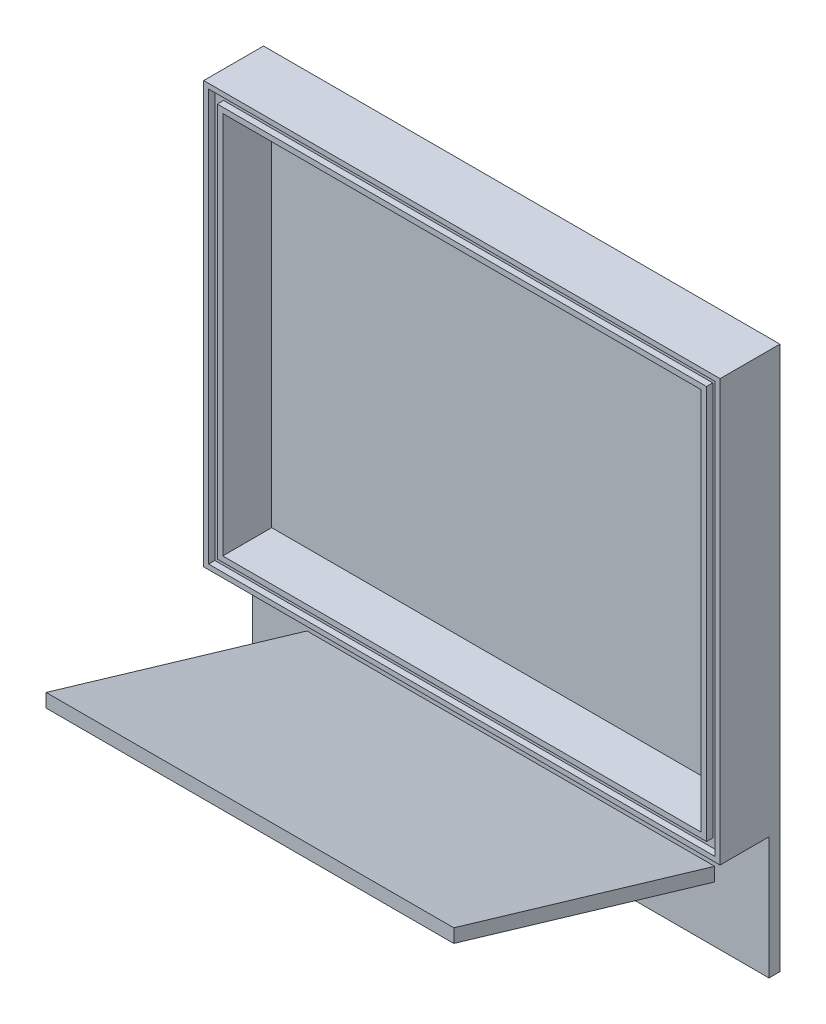
ISO-10303-21;
HEADER;
FILE_DESCRIPTION(('STEP AP214'),'2;1');
FILE_NAME('part.step','',(''),(''),'','','');
FILE_SCHEMA(('AUTOMOTIVE_DESIGN { 1 0 10303 214 1 1 1 1 }'));
ENDSEC;
DATA;
#1=APPLICATION_CONTEXT('core data for automotive mechanical design processes');
#2=APPLICATION_PROTOCOL_DEFINITION('international standard','automotive_design',2000,#1);
#3=PRODUCT_CONTEXT('',#1,'mechanical');
#4=PRODUCT('Part','Part','',(#3));
#5=PRODUCT_RELATED_PRODUCT_CATEGORY('part','',(#4));
#6=PRODUCT_DEFINITION_FORMATION('','',#4);
#7=PRODUCT_DEFINITION_CONTEXT('part definition',#1,'design');
#8=PRODUCT_DEFINITION('design','',#6,#7);
#9=PRODUCT_DEFINITION_SHAPE('','',#8);
#10=(LENGTH_UNIT() NAMED_UNIT(*) SI_UNIT(.MILLI.,.METRE.));
#11=(NAMED_UNIT(*) PLANE_ANGLE_UNIT() SI_UNIT($,.RADIAN.));
#12=(NAMED_UNIT(*) SI_UNIT($,.STERADIAN.) SOLID_ANGLE_UNIT());
#13=UNCERTAINTY_MEASURE_WITH_UNIT(LENGTH_MEASURE(1.E-05),#10,'distance_accuracy_value','');
#14=(GEOMETRIC_REPRESENTATION_CONTEXT(3) GLOBAL_UNCERTAINTY_ASSIGNED_CONTEXT((#13)) GLOBAL_UNIT_ASSIGNED_CONTEXT((#10,
#11,#12)) REPRESENTATION_CONTEXT('',''));
#15=CARTESIAN_POINT('',(0.,0.,0.));
#16=DIRECTION('',(0.,0.,1.));
#17=DIRECTION('',(1.,0.,0.));
#18=AXIS2_PLACEMENT_3D('',#15,#16,#17);
#19=CARTESIAN_POINT('',(0.,0.,4.));
#20=DIRECTION('',(0.,0.,-1.));
#21=DIRECTION('',(-1.,0.,0.));
#22=AXIS2_PLACEMENT_3D('',#19,#20,#21);
#23=PLANE('',#22);
#24=DIRECTION('',(1.,0.,0.));
#25=VECTOR('',#24,1.);
#26=CARTESIAN_POINT('',(0.,45.,4.));
#27=LINE('',#26,#25);
#28=CARTESIAN_POINT('',(-95.,45.,4.));
#29=VERTEX_POINT('',#28);
#30=CARTESIAN_POINT('',(95.,45.,4.));
#31=VERTEX_POINT('',#30);
#32=EDGE_CURVE('E353',#29,#31,#27,.T.);
#33=ORIENTED_EDGE('',*,*,#32,.F.);
#34=DIRECTION('',(0.,-1.,0.));
#35=VECTOR('',#34,1.);
#36=CARTESIAN_POINT('',(-95.,0.,4.));
#37=LINE('',#36,#35);
#38=CARTESIAN_POINT('',(-95.,0.,4.));
#39=VERTEX_POINT('',#38);
#40=EDGE_CURVE('E329',#29,#39,#37,.T.);
#41=ORIENTED_EDGE('',*,*,#40,.T.);
#42=DIRECTION('',(1.,0.,0.));
#43=VECTOR('',#42,1.);
#44=CARTESIAN_POINT('',(-95.,0.,4.));
#45=LINE('',#44,#43);
#46=CARTESIAN_POINT('',(95.,0.,4.));
#47=VERTEX_POINT('',#46);
#48=EDGE_CURVE('E335',#39,#47,#45,.T.);
#49=ORIENTED_EDGE('',*,*,#48,.T.);
#50=DIRECTION('',(0.,1.,0.));
#51=VECTOR('',#50,1.);
#52=CARTESIAN_POINT('',(95.,0.,4.));
#53=LINE('',#52,#51);
#54=EDGE_CURVE('E333',#47,#31,#53,.T.);
#55=ORIENTED_EDGE('',*,*,#54,.T.);
#56=EDGE_LOOP('',(#33,#41,#49,#55));
#57=FACE_BOUND('',#56,.T.);
#58=DIRECTION('',(0.,-1.,0.));
#59=VECTOR('',#58,1.);
#60=CARTESIAN_POINT('',(-75.,0.,4.));
#61=LINE('',#60,#59);
#62=CARTESIAN_POINT('',(-75.,25.5918367346939,4.));
#63=VERTEX_POINT('',#62);
#64=CARTESIAN_POINT('',(-75.,20.5918367346939,4.));
#65=VERTEX_POINT('',#64);
#66=EDGE_CURVE('E11',#63,#65,#61,.T.);
#67=ORIENTED_EDGE('',*,*,#66,.F.);
#68=DIRECTION('',(1.,0.,0.));
#69=VECTOR('',#68,1.);
#70=CARTESIAN_POINT('',(0.,25.5918367346939,4.));
#71=LINE('',#70,#69);
#72=CARTESIAN_POINT('',(75.,25.5918367346939,4.));
#73=VERTEX_POINT('',#72);
#74=EDGE_CURVE('E360',#63,#73,#71,.T.);
#75=ORIENTED_EDGE('',*,*,#74,.T.);
#76=DIRECTION('',(0.,-1.,0.));
#77=VECTOR('',#76,1.);
#78=CARTESIAN_POINT('',(75.,0.,4.));
#79=LINE('',#78,#77);
#80=CARTESIAN_POINT('',(75.,20.5918367346939,4.));
#81=VERTEX_POINT('',#80);
#82=EDGE_CURVE('E194',#73,#81,#79,.T.);
#83=ORIENTED_EDGE('',*,*,#82,.T.);
#84=DIRECTION('',(-1.,0.,0.));
#85=VECTOR('',#84,1.);
#86=CARTESIAN_POINT('',(0.,20.5918367346939,4.));
#87=LINE('',#86,#85);
#88=EDGE_CURVE('E50',#81,#65,#87,.T.);
#89=ORIENTED_EDGE('',*,*,#88,.T.);
#90=EDGE_LOOP('',(#67,#75,#83,#89));
#91=FACE_BOUND('',#90,.T.);
#92=ADVANCED_FACE('F39',(#57,#91),#23,.F.);
#93=CARTESIAN_POINT('',(-95.,0.,4.));
#94=DIRECTION('',(1.,0.,0.));
#95=DIRECTION('',(0.,0.,-1.));
#96=AXIS2_PLACEMENT_3D('',#93,#94,#95);
#97=PLANE('',#96);
#98=ORIENTED_EDGE('',*,*,#40,.F.);
#99=DIRECTION('',(0.,0.,-1.));
#100=VECTOR('',#99,1.);
#101=CARTESIAN_POINT('',(-95.,45.,22.));
#102=LINE('',#101,#100);
#103=CARTESIAN_POINT('',(-95.,45.,22.));
#104=VERTEX_POINT('',#103);
#105=EDGE_CURVE('E314',#104,#29,#102,.T.);
#106=ORIENTED_EDGE('',*,*,#105,.F.);
#107=DIRECTION('',(0.,-1.,0.));
#108=VECTOR('',#107,1.);
#109=CARTESIAN_POINT('',(-95.,45.,22.));
#110=LINE('',#109,#108);
#111=CARTESIAN_POINT('',(-95.,200.,22.));
#112=VERTEX_POINT('',#111);
#113=EDGE_CURVE('E298',#112,#104,#110,.T.);
#114=ORIENTED_EDGE('',*,*,#113,.F.);
#115=DIRECTION('',(0.,0.,-1.));
#116=VECTOR('',#115,1.);
#117=CARTESIAN_POINT('',(-95.,200.,4.));
#118=LINE('',#117,#116);
#119=CARTESIAN_POINT('',(-95.,200.,0.));
#120=VERTEX_POINT('',#119);
#121=EDGE_CURVE('E340',#112,#120,#118,.T.);
#122=ORIENTED_EDGE('',*,*,#121,.T.);
#123=DIRECTION('',(0.,-1.,0.));
#124=VECTOR('',#123,1.);
#125=CARTESIAN_POINT('',(-95.,0.,0.));
#126=LINE('',#125,#124);
#127=CARTESIAN_POINT('',(-95.,0.,0.));
#128=VERTEX_POINT('',#127);
#129=EDGE_CURVE('E328',#120,#128,#126,.T.);
#130=ORIENTED_EDGE('',*,*,#129,.T.);
#131=DIRECTION('',(0.,0.,-1.));
#132=VECTOR('',#131,1.);
#133=CARTESIAN_POINT('',(-95.,0.,4.));
#134=LINE('',#133,#132);
#135=EDGE_CURVE('E355',#39,#128,#134,.T.);
#136=ORIENTED_EDGE('',*,*,#135,.F.);
#137=EDGE_LOOP('',(#98,#106,#114,#122,#130,#136));
#138=FACE_BOUND('',#137,.T.);
#139=ADVANCED_FACE('F41',(#138),#97,.F.);
#140=CARTESIAN_POINT('',(-95.,0.,4.));
#141=DIRECTION('',(0.,1.,0.));
#142=DIRECTION('',(0.,0.,1.));
#143=AXIS2_PLACEMENT_3D('',#140,#141,#142);
#144=PLANE('',#143);
#145=DIRECTION('',(1.,0.,0.));
#146=VECTOR('',#145,1.);
#147=CARTESIAN_POINT('',(-95.,0.,0.));
#148=LINE('',#147,#146);
#149=CARTESIAN_POINT('',(95.,0.,0.));
#150=VERTEX_POINT('',#149);
#151=EDGE_CURVE('E336',#128,#150,#148,.T.);
#152=ORIENTED_EDGE('',*,*,#151,.T.);
#153=DIRECTION('',(0.,0.,-1.));
#154=VECTOR('',#153,1.);
#155=CARTESIAN_POINT('',(95.,0.,4.));
#156=LINE('',#155,#154);
#157=EDGE_CURVE('E349',#47,#150,#156,.T.);
#158=ORIENTED_EDGE('',*,*,#157,.F.);
#159=ORIENTED_EDGE('',*,*,#48,.F.);
#160=ORIENTED_EDGE('',*,*,#135,.T.);
#161=EDGE_LOOP('',(#152,#158,#159,#160));
#162=FACE_BOUND('',#161,.T.);
#163=ADVANCED_FACE('F387',(#162),#144,.F.);
#164=CARTESIAN_POINT('',(95.,0.,4.));
#165=DIRECTION('',(-1.,0.,0.));
#166=DIRECTION('',(0.,0.,1.));
#167=AXIS2_PLACEMENT_3D('',#164,#165,#166);
#168=PLANE('',#167);
#169=DIRECTION('',(0.,0.,-1.));
#170=VECTOR('',#169,1.);
#171=CARTESIAN_POINT('',(95.,200.,4.));
#172=LINE('',#171,#170);
#173=CARTESIAN_POINT('',(95.,200.,22.));
#174=VERTEX_POINT('',#173);
#175=CARTESIAN_POINT('',(95.,200.,0.));
#176=VERTEX_POINT('',#175);
#177=EDGE_CURVE('E347',#174,#176,#172,.T.);
#178=ORIENTED_EDGE('',*,*,#177,.F.);
#179=DIRECTION('',(0.,1.,0.));
#180=VECTOR('',#179,1.);
#181=CARTESIAN_POINT('',(95.,45.,22.));
#182=LINE('',#181,#180);
#183=CARTESIAN_POINT('',(95.,45.,22.));
#184=VERTEX_POINT('',#183);
#185=EDGE_CURVE('E301',#184,#174,#182,.T.);
#186=ORIENTED_EDGE('',*,*,#185,.F.);
#187=DIRECTION('',(0.,0.,-1.));
#188=VECTOR('',#187,1.);
#189=CARTESIAN_POINT('',(95.,45.,22.));
#190=LINE('',#189,#188);
#191=EDGE_CURVE('E313',#184,#31,#190,.T.);
#192=ORIENTED_EDGE('',*,*,#191,.T.);
#193=ORIENTED_EDGE('',*,*,#54,.F.);
#194=ORIENTED_EDGE('',*,*,#157,.T.);
#195=DIRECTION('',(0.,1.,0.));
#196=VECTOR('',#195,1.);
#197=CARTESIAN_POINT('',(95.,0.,0.));
#198=LINE('',#197,#196);
#199=EDGE_CURVE('E343',#150,#176,#198,.T.);
#200=ORIENTED_EDGE('',*,*,#199,.T.);
#201=EDGE_LOOP('',(#178,#186,#192,#193,#194,#200));
#202=FACE_BOUND('',#201,.T.);
#203=ADVANCED_FACE('F452',(#202),#168,.F.);
#204=CARTESIAN_POINT('',(-95.,200.,4.));
#205=DIRECTION('',(0.,-1.,0.));
#206=DIRECTION('',(0.,0.,-1.));
#207=AXIS2_PLACEMENT_3D('',#204,#205,#206);
#208=PLANE('',#207);
#209=DIRECTION('',(-1.,0.,0.));
#210=VECTOR('',#209,1.);
#211=CARTESIAN_POINT('',(-95.,200.,0.));
#212=LINE('',#211,#210);
#213=EDGE_CURVE('E334',#176,#120,#212,.T.);
#214=ORIENTED_EDGE('',*,*,#213,.T.);
#215=ORIENTED_EDGE('',*,*,#121,.F.);
#216=DIRECTION('',(-1.,0.,0.));
#217=VECTOR('',#216,1.);
#218=CARTESIAN_POINT('',(-95.,200.,22.));
#219=LINE('',#218,#217);
#220=EDGE_CURVE('E306',#174,#112,#219,.T.);
#221=ORIENTED_EDGE('',*,*,#220,.F.);
#222=ORIENTED_EDGE('',*,*,#177,.T.);
#223=EDGE_LOOP('',(#214,#215,#221,#222));
#224=FACE_BOUND('',#223,.T.);
#225=ADVANCED_FACE('F438',(#224),#208,.F.);
#226=CARTESIAN_POINT('',(0.,0.,0.));
#227=DIRECTION('',(0.,0.,-1.));
#228=DIRECTION('',(-1.,0.,0.));
#229=AXIS2_PLACEMENT_3D('',#226,#227,#228);
#230=PLANE('',#229);
#231=ORIENTED_EDGE('',*,*,#213,.F.);
#232=ORIENTED_EDGE('',*,*,#199,.F.);
#233=ORIENTED_EDGE('',*,*,#151,.F.);
#234=ORIENTED_EDGE('',*,*,#129,.F.);
#235=EDGE_LOOP('',(#231,#232,#233,#234));
#236=FACE_BOUND('',#235,.T.);
#237=ADVANCED_FACE('F432',(#236),#230,.T.);
#238=CARTESIAN_POINT('',(-95.,45.,22.));
#239=DIRECTION('',(0.,1.,0.));
#240=DIRECTION('',(0.,0.,1.));
#241=AXIS2_PLACEMENT_3D('',#238,#239,#240);
#242=PLANE('',#241);
#243=ORIENTED_EDGE('',*,*,#105,.T.);
#244=ORIENTED_EDGE('',*,*,#32,.T.);
#245=ORIENTED_EDGE('',*,*,#191,.F.);
#246=DIRECTION('',(1.,0.,0.));
#247=VECTOR('',#246,1.);
#248=CARTESIAN_POINT('',(-95.,45.,22.));
#249=LINE('',#248,#247);
#250=EDGE_CURVE('E302',#104,#184,#249,.T.);
#251=ORIENTED_EDGE('',*,*,#250,.F.);
#252=EDGE_LOOP('',(#243,#244,#245,#251));
#253=FACE_BOUND('',#252,.T.);
#254=ADVANCED_FACE('F435',(#253),#242,.F.);
#255=CARTESIAN_POINT('',(0.,0.,22.));
#256=DIRECTION('',(0.,0.,-1.));
#257=DIRECTION('',(-1.,0.,0.));
#258=AXIS2_PLACEMENT_3D('',#255,#256,#257);
#259=PLANE('',#258);
#260=DIRECTION('',(1.,0.,0.));
#261=VECTOR('',#260,1.);
#262=CARTESIAN_POINT('',(-93.2,46.8,22.));
#263=LINE('',#262,#261);
#264=CARTESIAN_POINT('',(-93.2,46.8,22.));
#265=VERTEX_POINT('',#264);
#266=CARTESIAN_POINT('',(93.2,46.8,22.));
#267=VERTEX_POINT('',#266);
#268=EDGE_CURVE('E264',#265,#267,#263,.T.);
#269=ORIENTED_EDGE('',*,*,#268,.F.);
#270=DIRECTION('',(0.,-1.,0.));
#271=VECTOR('',#270,1.);
#272=CARTESIAN_POINT('',(-93.2,46.8,22.));
#273=LINE('',#272,#271);
#274=CARTESIAN_POINT('',(-93.2,198.2,22.));
#275=VERTEX_POINT('',#274);
#276=EDGE_CURVE('E65',#275,#265,#273,.T.);
#277=ORIENTED_EDGE('',*,*,#276,.F.);
#278=DIRECTION('',(-1.,0.,0.));
#279=VECTOR('',#278,1.);
#280=CARTESIAN_POINT('',(-93.2,198.2,22.));
#281=LINE('',#280,#279);
#282=CARTESIAN_POINT('',(93.2,198.2,22.));
#283=VERTEX_POINT('',#282);
#284=EDGE_CURVE('E255',#283,#275,#281,.T.);
#285=ORIENTED_EDGE('',*,*,#284,.F.);
#286=DIRECTION('',(0.,1.,0.));
#287=VECTOR('',#286,1.);
#288=CARTESIAN_POINT('',(93.2,46.8,22.));
#289=LINE('',#288,#287);
#290=EDGE_CURVE('E268',#267,#283,#289,.T.);
#291=ORIENTED_EDGE('',*,*,#290,.F.);
#292=EDGE_LOOP('',(#269,#277,#285,#291));
#293=FACE_BOUND('',#292,.T.);
#294=ORIENTED_EDGE('',*,*,#113,.T.);
#295=ORIENTED_EDGE('',*,*,#250,.T.);
#296=ORIENTED_EDGE('',*,*,#185,.T.);
#297=ORIENTED_EDGE('',*,*,#220,.T.);
#298=EDGE_LOOP('',(#294,#295,#296,#297));
#299=FACE_BOUND('',#298,.T.);
#300=ADVANCED_FACE('F428',(#293,#299),#259,.F.);
#301=CARTESIAN_POINT('',(-93.2,46.8,19.7));
#302=DIRECTION('',(-1.,0.,0.));
#303=DIRECTION('',(0.,0.,1.));
#304=AXIS2_PLACEMENT_3D('',#301,#302,#303);
#305=PLANE('',#304);
#306=ORIENTED_EDGE('',*,*,#276,.T.);
#307=DIRECTION('',(0.,0.,1.));
#308=VECTOR('',#307,1.);
#309=CARTESIAN_POINT('',(-93.2,46.8,19.7));
#310=LINE('',#309,#308);
#311=CARTESIAN_POINT('',(-93.2,46.8,19.7));
#312=VERTEX_POINT('',#311);
#313=EDGE_CURVE('E263',#312,#265,#310,.T.);
#314=ORIENTED_EDGE('',*,*,#313,.F.);
#315=DIRECTION('',(0.,-1.,0.));
#316=VECTOR('',#315,1.);
#317=CARTESIAN_POINT('',(-93.2,46.8,19.7));
#318=LINE('',#317,#316);
#319=CARTESIAN_POINT('',(-93.2,198.2,19.7));
#320=VERTEX_POINT('',#319);
#321=EDGE_CURVE('E246',#320,#312,#318,.T.);
#322=ORIENTED_EDGE('',*,*,#321,.F.);
#323=DIRECTION('',(0.,0.,1.));
#324=VECTOR('',#323,1.);
#325=CARTESIAN_POINT('',(-93.2,198.2,19.7));
#326=LINE('',#325,#324);
#327=EDGE_CURVE('E272',#320,#275,#326,.T.);
#328=ORIENTED_EDGE('',*,*,#327,.T.);
#329=EDGE_LOOP('',(#306,#314,#322,#328));
#330=FACE_BOUND('',#329,.T.);
#331=ADVANCED_FACE('F431',(#330),#305,.F.);
#332=CARTESIAN_POINT('',(-93.2,198.2,19.7));
#333=DIRECTION('',(0.,1.,0.));
#334=DIRECTION('',(0.,0.,1.));
#335=AXIS2_PLACEMENT_3D('',#332,#333,#334);
#336=PLANE('',#335);
#337=ORIENTED_EDGE('',*,*,#284,.T.);
#338=ORIENTED_EDGE('',*,*,#327,.F.);
#339=DIRECTION('',(-1.,0.,0.));
#340=VECTOR('',#339,1.);
#341=CARTESIAN_POINT('',(-93.2,198.2,19.7));
#342=LINE('',#341,#340);
#343=CARTESIAN_POINT('',(93.2,198.2,19.7));
#344=VERTEX_POINT('',#343);
#345=EDGE_CURVE('E257',#344,#320,#342,.T.);
#346=ORIENTED_EDGE('',*,*,#345,.F.);
#347=DIRECTION('',(0.,0.,1.));
#348=VECTOR('',#347,1.);
#349=CARTESIAN_POINT('',(93.2,198.2,19.7));
#350=LINE('',#349,#348);
#351=EDGE_CURVE('E277',#344,#283,#350,.T.);
#352=ORIENTED_EDGE('',*,*,#351,.T.);
#353=EDGE_LOOP('',(#337,#338,#346,#352));
#354=FACE_BOUND('',#353,.T.);
#355=ADVANCED_FACE('F540',(#354),#336,.F.);
#356=CARTESIAN_POINT('',(93.2,46.8,19.7));
#357=DIRECTION('',(1.,0.,0.));
#358=DIRECTION('',(0.,0.,-1.));
#359=AXIS2_PLACEMENT_3D('',#356,#357,#358);
#360=PLANE('',#359);
#361=ORIENTED_EDGE('',*,*,#290,.T.);
#362=ORIENTED_EDGE('',*,*,#351,.F.);
#363=DIRECTION('',(0.,1.,0.));
#364=VECTOR('',#363,1.);
#365=CARTESIAN_POINT('',(93.2,46.8,19.7));
#366=LINE('',#365,#364);
#367=CARTESIAN_POINT('',(93.2,46.8,19.7));
#368=VERTEX_POINT('',#367);
#369=EDGE_CURVE('E260',#368,#344,#366,.T.);
#370=ORIENTED_EDGE('',*,*,#369,.F.);
#371=DIRECTION('',(0.,0.,1.));
#372=VECTOR('',#371,1.);
#373=CARTESIAN_POINT('',(93.2,46.8,19.7));
#374=LINE('',#373,#372);
#375=EDGE_CURVE('E279',#368,#267,#374,.T.);
#376=ORIENTED_EDGE('',*,*,#375,.T.);
#377=EDGE_LOOP('',(#361,#362,#370,#376));
#378=FACE_BOUND('',#377,.T.);
#379=ADVANCED_FACE('F546',(#378),#360,.F.);
#380=CARTESIAN_POINT('',(-93.2,46.8,19.7));
#381=DIRECTION('',(0.,-1.,0.));
#382=DIRECTION('',(0.,0.,-1.));
#383=AXIS2_PLACEMENT_3D('',#380,#381,#382);
#384=PLANE('',#383);
#385=ORIENTED_EDGE('',*,*,#268,.T.);
#386=ORIENTED_EDGE('',*,*,#375,.F.);
#387=DIRECTION('',(1.,0.,0.));
#388=VECTOR('',#387,1.);
#389=CARTESIAN_POINT('',(-93.2,46.8,19.7));
#390=LINE('',#389,#388);
#391=EDGE_CURVE('E251',#312,#368,#390,.T.);
#392=ORIENTED_EDGE('',*,*,#391,.F.);
#393=ORIENTED_EDGE('',*,*,#313,.T.);
#394=EDGE_LOOP('',(#385,#386,#392,#393));
#395=FACE_BOUND('',#394,.T.);
#396=ADVANCED_FACE('F557',(#395),#384,.F.);
#397=CARTESIAN_POINT('',(0.,0.,19.7));
#398=DIRECTION('',(0.,0.,-1.));
#399=DIRECTION('',(-1.,0.,0.));
#400=AXIS2_PLACEMENT_3D('',#397,#398,#399);
#401=PLANE('',#400);
#402=DIRECTION('',(0.,-1.,0.));
#403=VECTOR('',#402,1.);
#404=CARTESIAN_POINT('',(-90.,50.,19.7));
#405=LINE('',#404,#403);
#406=CARTESIAN_POINT('',(-90.,195.,19.7));
#407=VERTEX_POINT('',#406);
#408=CARTESIAN_POINT('',(-90.,50.,19.7));
#409=VERTEX_POINT('',#408);
#410=EDGE_CURVE('E217',#407,#409,#405,.T.);
#411=ORIENTED_EDGE('',*,*,#410,.F.);
#412=DIRECTION('',(-1.,0.,0.));
#413=VECTOR('',#412,1.);
#414=CARTESIAN_POINT('',(-90.,195.,19.7));
#415=LINE('',#414,#413);
#416=CARTESIAN_POINT('',(90.,195.,19.7));
#417=VERTEX_POINT('',#416);
#418=EDGE_CURVE('E229',#417,#407,#415,.T.);
#419=ORIENTED_EDGE('',*,*,#418,.F.);
#420=DIRECTION('',(0.,1.,0.));
#421=VECTOR('',#420,1.);
#422=CARTESIAN_POINT('',(90.,50.,19.7));
#423=LINE('',#422,#421);
#424=CARTESIAN_POINT('',(90.,50.,19.7));
#425=VERTEX_POINT('',#424);
#426=EDGE_CURVE('E223',#425,#417,#423,.T.);
#427=ORIENTED_EDGE('',*,*,#426,.F.);
#428=DIRECTION('',(1.,0.,0.));
#429=VECTOR('',#428,1.);
#430=CARTESIAN_POINT('',(-90.,50.,19.7));
#431=LINE('',#430,#429);
#432=EDGE_CURVE('E222',#409,#425,#431,.T.);
#433=ORIENTED_EDGE('',*,*,#432,.F.);
#434=EDGE_LOOP('',(#411,#419,#427,#433));
#435=FACE_BOUND('',#434,.T.);
#436=ORIENTED_EDGE('',*,*,#321,.T.);
#437=ORIENTED_EDGE('',*,*,#391,.T.);
#438=ORIENTED_EDGE('',*,*,#369,.T.);
#439=ORIENTED_EDGE('',*,*,#345,.T.);
#440=EDGE_LOOP('',(#436,#437,#438,#439));
#441=FACE_BOUND('',#440,.T.);
#442=ADVANCED_FACE('F567',(#435,#441),#401,.F.);
#443=CARTESIAN_POINT('',(-90.,50.,19.7));
#444=DIRECTION('',(-1.,0.,0.));
#445=DIRECTION('',(0.,0.,1.));
#446=AXIS2_PLACEMENT_3D('',#443,#444,#445);
#447=PLANE('',#446);
#448=DIRECTION('',(0.,-1.,0.));
#449=VECTOR('',#448,1.);
#450=CARTESIAN_POINT('',(-90.,50.,22.));
#451=LINE('',#450,#449);
#452=CARTESIAN_POINT('',(-90.,195.,22.));
#453=VERTEX_POINT('',#452);
#454=CARTESIAN_POINT('',(-90.,50.,22.));
#455=VERTEX_POINT('',#454);
#456=EDGE_CURVE('E216',#453,#455,#451,.T.);
#457=ORIENTED_EDGE('',*,*,#456,.F.);
#458=DIRECTION('',(0.,0.,1.));
#459=VECTOR('',#458,1.);
#460=CARTESIAN_POINT('',(-90.,195.,19.7));
#461=LINE('',#460,#459);
#462=EDGE_CURVE('E245',#407,#453,#461,.T.);
#463=ORIENTED_EDGE('',*,*,#462,.F.);
#464=ORIENTED_EDGE('',*,*,#410,.T.);
#465=DIRECTION('',(0.,0.,1.));
#466=VECTOR('',#465,1.);
#467=CARTESIAN_POINT('',(-90.,50.,19.7));
#468=LINE('',#467,#466);
#469=EDGE_CURVE('E233',#409,#455,#468,.T.);
#470=ORIENTED_EDGE('',*,*,#469,.T.);
#471=EDGE_LOOP('',(#457,#463,#464,#470));
#472=FACE_BOUND('',#471,.T.);
#473=ADVANCED_FACE('F578',(#472),#447,.T.);
#474=CARTESIAN_POINT('',(-90.,195.,19.7));
#475=DIRECTION('',(0.,1.,0.));
#476=DIRECTION('',(0.,0.,1.));
#477=AXIS2_PLACEMENT_3D('',#474,#475,#476);
#478=PLANE('',#477);
#479=DIRECTION('',(-1.,0.,0.));
#480=VECTOR('',#479,1.);
#481=CARTESIAN_POINT('',(-90.,195.,22.));
#482=LINE('',#481,#480);
#483=CARTESIAN_POINT('',(90.,195.,22.));
#484=VERTEX_POINT('',#483);
#485=EDGE_CURVE('E225',#484,#453,#482,.T.);
#486=ORIENTED_EDGE('',*,*,#485,.F.);
#487=DIRECTION('',(0.,0.,1.));
#488=VECTOR('',#487,1.);
#489=CARTESIAN_POINT('',(90.,195.,19.7));
#490=LINE('',#489,#488);
#491=EDGE_CURVE('E241',#417,#484,#490,.T.);
#492=ORIENTED_EDGE('',*,*,#491,.F.);
#493=ORIENTED_EDGE('',*,*,#418,.T.);
#494=ORIENTED_EDGE('',*,*,#462,.T.);
#495=EDGE_LOOP('',(#486,#492,#493,#494));
#496=FACE_BOUND('',#495,.T.);
#497=ADVANCED_FACE('F588',(#496),#478,.T.);
#498=CARTESIAN_POINT('',(90.,50.,19.7));
#499=DIRECTION('',(1.,0.,0.));
#500=DIRECTION('',(0.,0.,-1.));
#501=AXIS2_PLACEMENT_3D('',#498,#499,#500);
#502=PLANE('',#501);
#503=DIRECTION('',(0.,1.,0.));
#504=VECTOR('',#503,1.);
#505=CARTESIAN_POINT('',(90.,50.,22.));
#506=LINE('',#505,#504);
#507=CARTESIAN_POINT('',(90.,50.,22.));
#508=VERTEX_POINT('',#507);
#509=EDGE_CURVE('E240',#508,#484,#506,.T.);
#510=ORIENTED_EDGE('',*,*,#509,.F.);
#511=DIRECTION('',(0.,0.,1.));
#512=VECTOR('',#511,1.);
#513=CARTESIAN_POINT('',(90.,50.,19.7));
#514=LINE('',#513,#512);
#515=EDGE_CURVE('E248',#425,#508,#514,.T.);
#516=ORIENTED_EDGE('',*,*,#515,.F.);
#517=ORIENTED_EDGE('',*,*,#426,.T.);
#518=ORIENTED_EDGE('',*,*,#491,.T.);
#519=EDGE_LOOP('',(#510,#516,#517,#518));
#520=FACE_BOUND('',#519,.T.);
#521=ADVANCED_FACE('F401',(#520),#502,.T.);
#522=CARTESIAN_POINT('',(-90.,50.,19.7));
#523=DIRECTION('',(0.,-1.,0.));
#524=DIRECTION('',(0.,0.,-1.));
#525=AXIS2_PLACEMENT_3D('',#522,#523,#524);
#526=PLANE('',#525);
#527=DIRECTION('',(1.,0.,0.));
#528=VECTOR('',#527,1.);
#529=CARTESIAN_POINT('',(-90.,50.,22.));
#530=LINE('',#529,#528);
#531=EDGE_CURVE('E235',#455,#508,#530,.T.);
#532=ORIENTED_EDGE('',*,*,#531,.F.);
#533=ORIENTED_EDGE('',*,*,#469,.F.);
#534=ORIENTED_EDGE('',*,*,#432,.T.);
#535=ORIENTED_EDGE('',*,*,#515,.T.);
#536=EDGE_LOOP('',(#532,#533,#534,#535));
#537=FACE_BOUND('',#536,.T.);
#538=ADVANCED_FACE('F395',(#537),#526,.T.);
#539=DIRECTION('',(-1.,0.,0.));
#540=VECTOR('',#539,1.);
#541=CARTESIAN_POINT('',(0.,193.,4.));
#542=LINE('',#541,#540);
#543=CARTESIAN_POINT('',(88.,193.,4.));
#544=VERTEX_POINT('',#543);
#545=CARTESIAN_POINT('',(-88.,193.,4.));
#546=VERTEX_POINT('',#545);
#547=EDGE_CURVE('E320',#544,#546,#542,.T.);
#548=ORIENTED_EDGE('',*,*,#547,.T.);
#549=DIRECTION('',(0.,-1.,0.));
#550=VECTOR('',#549,1.);
#551=CARTESIAN_POINT('',(-88.,0.,4.));
#552=LINE('',#551,#550);
#553=CARTESIAN_POINT('',(-88.,52.,4.));
#554=VERTEX_POINT('',#553);
#555=EDGE_CURVE('E326',#546,#554,#552,.T.);
#556=ORIENTED_EDGE('',*,*,#555,.T.);
#557=DIRECTION('',(1.,0.,0.));
#558=VECTOR('',#557,1.);
#559=CARTESIAN_POINT('',(0.,52.,4.));
#560=LINE('',#559,#558);
#561=CARTESIAN_POINT('',(88.,52.,4.));
#562=VERTEX_POINT('',#561);
#563=EDGE_CURVE('E323',#554,#562,#560,.T.);
#564=ORIENTED_EDGE('',*,*,#563,.T.);
#565=DIRECTION('',(0.,1.,0.));
#566=VECTOR('',#565,1.);
#567=CARTESIAN_POINT('',(88.,0.,4.));
#568=LINE('',#567,#566);
#569=EDGE_CURVE('E319',#562,#544,#568,.T.);
#570=ORIENTED_EDGE('',*,*,#569,.T.);
#571=EDGE_LOOP('',(#548,#556,#564,#570));
#572=FACE_BOUND('',#571,.T.);
#573=ADVANCED_FACE('F379',(#572),#23,.F.);
#574=CARTESIAN_POINT('',(-88.,52.,22.));
#575=DIRECTION('',(0.,1.,0.));
#576=DIRECTION('',(0.,0.,1.));
#577=AXIS2_PLACEMENT_3D('',#574,#575,#576);
#578=PLANE('',#577);
#579=ORIENTED_EDGE('',*,*,#563,.F.);
#580=DIRECTION('',(0.,0.,-1.));
#581=VECTOR('',#580,1.);
#582=CARTESIAN_POINT('',(-88.,52.,22.));
#583=LINE('',#582,#581);
#584=CARTESIAN_POINT('',(-88.,52.,22.));
#585=VERTEX_POINT('',#584);
#586=EDGE_CURVE('E300',#585,#554,#583,.T.);
#587=ORIENTED_EDGE('',*,*,#586,.F.);
#588=DIRECTION('',(1.,0.,0.));
#589=VECTOR('',#588,1.);
#590=CARTESIAN_POINT('',(-88.,52.,22.));
#591=LINE('',#590,#589);
#592=CARTESIAN_POINT('',(88.,52.,22.));
#593=VERTEX_POINT('',#592);
#594=EDGE_CURVE('E285',#585,#593,#591,.T.);
#595=ORIENTED_EDGE('',*,*,#594,.T.);
#596=DIRECTION('',(0.,0.,-1.));
#597=VECTOR('',#596,1.);
#598=CARTESIAN_POINT('',(88.,52.,22.));
#599=LINE('',#598,#597);
#600=EDGE_CURVE('E294',#593,#562,#599,.T.);
#601=ORIENTED_EDGE('',*,*,#600,.T.);
#602=EDGE_LOOP('',(#579,#587,#595,#601));
#603=FACE_BOUND('',#602,.T.);
#604=ADVANCED_FACE('F392',(#603),#578,.T.);
#605=CARTESIAN_POINT('',(88.,52.,22.));
#606=DIRECTION('',(-1.,0.,0.));
#607=DIRECTION('',(0.,0.,1.));
#608=AXIS2_PLACEMENT_3D('',#605,#606,#607);
#609=PLANE('',#608);
#610=ORIENTED_EDGE('',*,*,#569,.F.);
#611=ORIENTED_EDGE('',*,*,#600,.F.);
#612=DIRECTION('',(0.,1.,0.));
#613=VECTOR('',#612,1.);
#614=CARTESIAN_POINT('',(88.,52.,22.));
#615=LINE('',#614,#613);
#616=CARTESIAN_POINT('',(88.,193.,22.));
#617=VERTEX_POINT('',#616);
#618=EDGE_CURVE('E281',#593,#617,#615,.T.);
#619=ORIENTED_EDGE('',*,*,#618,.T.);
#620=DIRECTION('',(0.,0.,-1.));
#621=VECTOR('',#620,1.);
#622=CARTESIAN_POINT('',(88.,193.,22.));
#623=LINE('',#622,#621);
#624=EDGE_CURVE('E292',#617,#544,#623,.T.);
#625=ORIENTED_EDGE('',*,*,#624,.T.);
#626=EDGE_LOOP('',(#610,#611,#619,#625));
#627=FACE_BOUND('',#626,.T.);
#628=ADVANCED_FACE('F400',(#627),#609,.T.);
#629=CARTESIAN_POINT('',(-88.,193.,22.));
#630=DIRECTION('',(0.,-1.,0.));
#631=DIRECTION('',(0.,0.,-1.));
#632=AXIS2_PLACEMENT_3D('',#629,#630,#631);
#633=PLANE('',#632);
#634=ORIENTED_EDGE('',*,*,#547,.F.);
#635=ORIENTED_EDGE('',*,*,#624,.F.);
#636=DIRECTION('',(-1.,0.,0.));
#637=VECTOR('',#636,1.);
#638=CARTESIAN_POINT('',(-88.,193.,22.));
#639=LINE('',#638,#637);
#640=CARTESIAN_POINT('',(-88.,193.,22.));
#641=VERTEX_POINT('',#640);
#642=EDGE_CURVE('E289',#617,#641,#639,.T.);
#643=ORIENTED_EDGE('',*,*,#642,.T.);
#644=DIRECTION('',(0.,0.,-1.));
#645=VECTOR('',#644,1.);
#646=CARTESIAN_POINT('',(-88.,193.,22.));
#647=LINE('',#646,#645);
#648=EDGE_CURVE('E290',#641,#546,#647,.T.);
#649=ORIENTED_EDGE('',*,*,#648,.T.);
#650=EDGE_LOOP('',(#634,#635,#643,#649));
#651=FACE_BOUND('',#650,.T.);
#652=ADVANCED_FACE('F409',(#651),#633,.T.);
#653=CARTESIAN_POINT('',(-88.,52.,22.));
#654=DIRECTION('',(1.,0.,0.));
#655=DIRECTION('',(0.,0.,-1.));
#656=AXIS2_PLACEMENT_3D('',#653,#654,#655);
#657=PLANE('',#656);
#658=ORIENTED_EDGE('',*,*,#555,.F.);
#659=ORIENTED_EDGE('',*,*,#648,.F.);
#660=DIRECTION('',(0.,-1.,0.));
#661=VECTOR('',#660,1.);
#662=CARTESIAN_POINT('',(-88.,52.,22.));
#663=LINE('',#662,#661);
#664=EDGE_CURVE('E274',#641,#585,#663,.T.);
#665=ORIENTED_EDGE('',*,*,#664,.T.);
#666=ORIENTED_EDGE('',*,*,#586,.T.);
#667=EDGE_LOOP('',(#658,#659,#665,#666));
#668=FACE_BOUND('',#667,.T.);
#669=ADVANCED_FACE('F419',(#668),#657,.T.);
#670=ORIENTED_EDGE('',*,*,#664,.F.);
#671=ORIENTED_EDGE('',*,*,#642,.F.);
#672=ORIENTED_EDGE('',*,*,#618,.F.);
#673=ORIENTED_EDGE('',*,*,#594,.F.);
#674=EDGE_LOOP('',(#670,#671,#672,#673));
#675=FACE_BOUND('',#674,.T.);
#676=ORIENTED_EDGE('',*,*,#456,.T.);
#677=ORIENTED_EDGE('',*,*,#531,.T.);
#678=ORIENTED_EDGE('',*,*,#509,.T.);
#679=ORIENTED_EDGE('',*,*,#485,.T.);
#680=EDGE_LOOP('',(#676,#677,#678,#679));
#681=FACE_BOUND('',#680,.T.);
#682=ADVANCED_FACE('F417',(#675,#681),#259,.F.);
#683=CARTESIAN_POINT('',(-75.,49.,100.));
#684=DIRECTION('',(0.,-0.95889676515414,0.283755165198674));
#685=DIRECTION('',(0.,-0.283755165198674,-0.95889676515414));
#686=AXIS2_PLACEMENT_3D('',#683,#684,#685);
#687=PLANE('',#686);
#688=ORIENTED_EDGE('',*,*,#88,.F.);
#689=DIRECTION('',(0.,-0.283755165198674,-0.95889676515414));
#690=VECTOR('',#689,1.);
#691=CARTESIAN_POINT('',(75.,49.,100.));
#692=LINE('',#691,#690);
#693=CARTESIAN_POINT('',(75.,49.,100.));
#694=VERTEX_POINT('',#693);
#695=EDGE_CURVE('E53',#694,#81,#692,.T.);
#696=ORIENTED_EDGE('',*,*,#695,.F.);
#697=DIRECTION('',(1.,0.,0.));
#698=VECTOR('',#697,1.);
#699=CARTESIAN_POINT('',(-75.,49.,100.));
#700=LINE('',#699,#698);
#701=CARTESIAN_POINT('',(-75.,49.,100.));
#702=VERTEX_POINT('',#701);
#703=EDGE_CURVE('E204',#702,#694,#700,.T.);
#704=ORIENTED_EDGE('',*,*,#703,.F.);
#705=DIRECTION('',(0.,-0.283755165198674,-0.95889676515414));
#706=VECTOR('',#705,1.);
#707=CARTESIAN_POINT('',(-75.,49.,100.));
#708=LINE('',#707,#706);
#709=EDGE_CURVE('E208',#702,#65,#708,.T.);
#710=ORIENTED_EDGE('',*,*,#709,.T.);
#711=EDGE_LOOP('',(#688,#696,#704,#710));
#712=FACE_BOUND('',#711,.T.);
#713=ADVANCED_FACE('F365',(#712),#687,.T.);
#714=CARTESIAN_POINT('',(-75.,25.,2.));
#715=DIRECTION('',(0.,0.95889676515414,-0.283755165198674));
#716=DIRECTION('',(0.,0.283755165198674,0.95889676515414));
#717=AXIS2_PLACEMENT_3D('',#714,#715,#716);
#718=PLANE('',#717);
#719=ORIENTED_EDGE('',*,*,#74,.F.);
#720=DIRECTION('',(0.,0.283755165198674,0.95889676515414));
#721=VECTOR('',#720,1.);
#722=CARTESIAN_POINT('',(-75.,25.,2.));
#723=LINE('',#722,#721);
#724=CARTESIAN_POINT('',(-75.,54.,100.));
#725=VERTEX_POINT('',#724);
#726=EDGE_CURVE('E199',#63,#725,#723,.T.);
#727=ORIENTED_EDGE('',*,*,#726,.T.);
#728=DIRECTION('',(1.,0.,0.));
#729=VECTOR('',#728,1.);
#730=CARTESIAN_POINT('',(-75.,54.,100.));
#731=LINE('',#730,#729);
#732=CARTESIAN_POINT('',(75.,54.,100.));
#733=VERTEX_POINT('',#732);
#734=EDGE_CURVE('E197',#725,#733,#731,.T.);
#735=ORIENTED_EDGE('',*,*,#734,.T.);
#736=DIRECTION('',(0.,0.283755165198674,0.95889676515414));
#737=VECTOR('',#736,1.);
#738=CARTESIAN_POINT('',(75.,25.,2.));
#739=LINE('',#738,#737);
#740=EDGE_CURVE('E187',#73,#733,#739,.T.);
#741=ORIENTED_EDGE('',*,*,#740,.F.);
#742=EDGE_LOOP('',(#719,#727,#735,#741));
#743=FACE_BOUND('',#742,.T.);
#744=ADVANCED_FACE('F196',(#743),#718,.T.);
#745=CARTESIAN_POINT('',(-75.,0.,0.));
#746=DIRECTION('',(1.,0.,0.));
#747=DIRECTION('',(0.,0.,-1.));
#748=AXIS2_PLACEMENT_3D('',#745,#746,#747);
#749=PLANE('',#748);
#750=ORIENTED_EDGE('',*,*,#726,.F.);
#751=ORIENTED_EDGE('',*,*,#66,.T.);
#752=ORIENTED_EDGE('',*,*,#709,.F.);
#753=DIRECTION('',(0.,-1.,0.));
#754=VECTOR('',#753,1.);
#755=CARTESIAN_POINT('',(-75.,54.,100.));
#756=LINE('',#755,#754);
#757=EDGE_CURVE('E202',#725,#702,#756,.T.);
#758=ORIENTED_EDGE('',*,*,#757,.F.);
#759=EDGE_LOOP('',(#750,#751,#752,#758));
#760=FACE_BOUND('',#759,.T.);
#761=ADVANCED_FACE('F370',(#760),#749,.F.);
#762=CARTESIAN_POINT('',(75.,0.,0.));
#763=DIRECTION('',(1.,0.,0.));
#764=DIRECTION('',(0.,0.,-1.));
#765=AXIS2_PLACEMENT_3D('',#762,#763,#764);
#766=PLANE('',#765);
#767=ORIENTED_EDGE('',*,*,#82,.F.);
#768=ORIENTED_EDGE('',*,*,#740,.T.);
#769=DIRECTION('',(0.,-1.,0.));
#770=VECTOR('',#769,1.);
#771=CARTESIAN_POINT('',(75.,54.,100.));
#772=LINE('',#771,#770);
#773=EDGE_CURVE('E188',#733,#694,#772,.T.);
#774=ORIENTED_EDGE('',*,*,#773,.T.);
#775=ORIENTED_EDGE('',*,*,#695,.T.);
#776=EDGE_LOOP('',(#767,#768,#774,#775));
#777=FACE_BOUND('',#776,.T.);
#778=ADVANCED_FACE('F189',(#777),#766,.T.);
#779=CARTESIAN_POINT('',(-75.,54.,100.));
#780=DIRECTION('',(0.,0.,1.));
#781=DIRECTION('',(1.,0.,0.));
#782=AXIS2_PLACEMENT_3D('',#779,#780,#781);
#783=PLANE('',#782);
#784=ORIENTED_EDGE('',*,*,#703,.T.);
#785=ORIENTED_EDGE('',*,*,#773,.F.);
#786=ORIENTED_EDGE('',*,*,#734,.F.);
#787=ORIENTED_EDGE('',*,*,#757,.T.);
#788=EDGE_LOOP('',(#784,#785,#786,#787));
#789=FACE_BOUND('',#788,.T.);
#790=ADVANCED_FACE('F210',(#789),#783,.T.);
#791=CLOSED_SHELL('',(#92,#139,#163,#203,#225,#237,#254,#300,#331,#355,#379,#396,#442,#473,#497,
#521,#538,#573,#604,#628,#652,#669,#682,#713,#744,#761,#778,#790));
#792=MANIFOLD_SOLID_BREP('B2',#791);
#793=ADVANCED_BREP_SHAPE_REPRESENTATION('',(#18,#792),#14);
#794=SHAPE_DEFINITION_REPRESENTATION(#9,#793);
ENDSEC;
END-ISO-10303-21;
